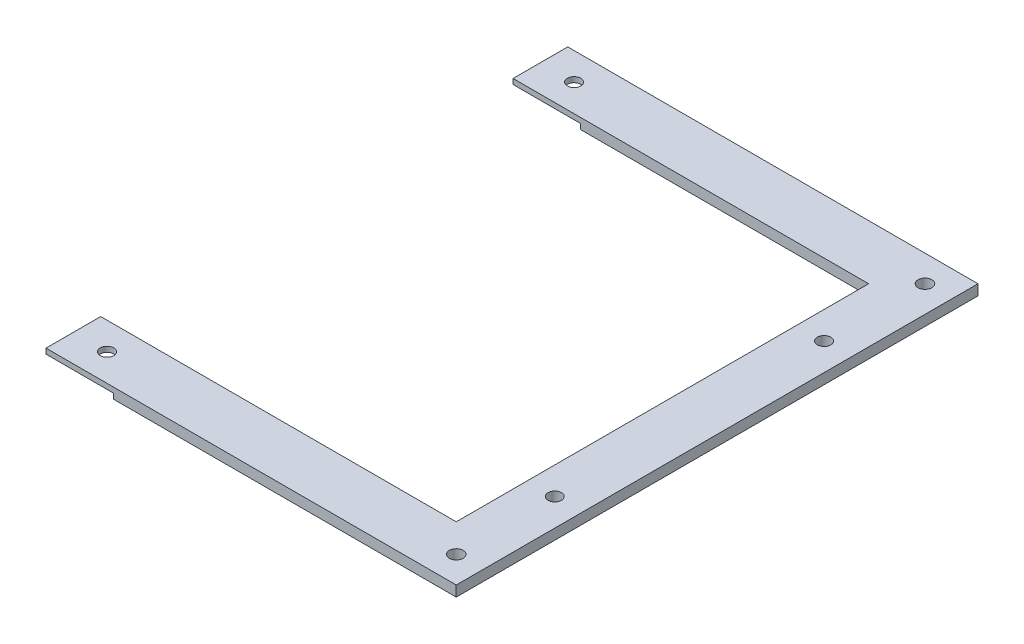
ISO-10303-21;
HEADER;
FILE_DESCRIPTION(('STEP AP214'),'2;1');
FILE_NAME('part.step','',(''),(''),'','','');
FILE_SCHEMA(('AUTOMOTIVE_DESIGN { 1 0 10303 214 1 1 1 1 }'));
ENDSEC;
DATA;
#1=APPLICATION_CONTEXT('core data for automotive mechanical design processes');
#2=APPLICATION_PROTOCOL_DEFINITION('international standard','automotive_design',2000,#1);
#3=PRODUCT_CONTEXT('',#1,'mechanical');
#4=PRODUCT('Part','Part','',(#3));
#5=PRODUCT_RELATED_PRODUCT_CATEGORY('part','',(#4));
#6=PRODUCT_DEFINITION_FORMATION('','',#4);
#7=PRODUCT_DEFINITION_CONTEXT('part definition',#1,'design');
#8=PRODUCT_DEFINITION('design','',#6,#7);
#9=PRODUCT_DEFINITION_SHAPE('','',#8);
#10=(LENGTH_UNIT() NAMED_UNIT(*) SI_UNIT(.MILLI.,.METRE.));
#11=(NAMED_UNIT(*) PLANE_ANGLE_UNIT() SI_UNIT($,.RADIAN.));
#12=(NAMED_UNIT(*) SI_UNIT($,.STERADIAN.) SOLID_ANGLE_UNIT());
#13=UNCERTAINTY_MEASURE_WITH_UNIT(LENGTH_MEASURE(1.E-05),#10,'distance_accuracy_value','');
#14=(GEOMETRIC_REPRESENTATION_CONTEXT(3) GLOBAL_UNCERTAINTY_ASSIGNED_CONTEXT((#13)) GLOBAL_UNIT_ASSIGNED_CONTEXT((#10,
#11,#12)) REPRESENTATION_CONTEXT('',''));
#15=CARTESIAN_POINT('',(0.,0.,0.));
#16=DIRECTION('',(0.,0.,1.));
#17=DIRECTION('',(1.,0.,0.));
#18=AXIS2_PLACEMENT_3D('',#15,#16,#17);
#19=CARTESIAN_POINT('',(-12.7,-1.984375,-98.435));
#20=DIRECTION('',(0.,-1.,0.));
#21=DIRECTION('',(1.,0.,0.));
#22=AXIS2_PLACEMENT_3D('',#19,#20,#21);
#23=PLANE('',#22);
#24=DIRECTION('',(0.,0.,1.));
#25=VECTOR('',#24,1.);
#26=CARTESIAN_POINT('',(-12.7,-1.984375,-98.435));
#27=LINE('',#26,#25);
#28=CARTESIAN_POINT('',(-12.7,-1.984375,77.7875));
#29=VERTEX_POINT('',#28);
#30=CARTESIAN_POINT('',(-12.7,-1.984375,98.425));
#31=VERTEX_POINT('',#30);
#32=EDGE_CURVE('E208',#29,#31,#27,.T.);
#33=ORIENTED_EDGE('',*,*,#32,.F.);
#34=DIRECTION('',(1.,0.,0.));
#35=VECTOR('',#34,1.);
#36=CARTESIAN_POINT('',(-121.44375,-1.98437500000001,77.7875));
#37=LINE('',#36,#35);
#38=CARTESIAN_POINT('',(12.7,-1.984375,77.7875));
#39=VERTEX_POINT('',#38);
#40=EDGE_CURVE('E233',#29,#39,#37,.T.);
#41=ORIENTED_EDGE('',*,*,#40,.T.);
#42=DIRECTION('',(0.,0.,1.));
#43=VECTOR('',#42,1.);
#44=CARTESIAN_POINT('',(12.7,-1.984375,-98.435));
#45=LINE('',#44,#43);
#46=CARTESIAN_POINT('',(12.7,-1.984375,98.425));
#47=VERTEX_POINT('',#46);
#48=EDGE_CURVE('E11',#39,#47,#45,.T.);
#49=ORIENTED_EDGE('',*,*,#48,.T.);
#50=DIRECTION('',(1.,0.,0.));
#51=VECTOR('',#50,1.);
#52=CARTESIAN_POINT('',(-142.08125,-1.98437500000002,98.425));
#53=LINE('',#52,#51);
#54=EDGE_CURVE('E224',#31,#47,#53,.T.);
#55=ORIENTED_EDGE('',*,*,#54,.F.);
#56=EDGE_LOOP('',(#33,#41,#49,#55));
#57=FACE_BOUND('',#56,.T.);
#58=CARTESIAN_POINT('',(0.,-1.984375,88.10625));
#59=DIRECTION('',(0.,-1.,0.));
#60=DIRECTION('',(1.,0.,0.));
#61=AXIS2_PLACEMENT_3D('',#58,#59,#60);
#62=CIRCLE('',#61,2.5273);
#63=CARTESIAN_POINT('',(2.52729999999998,-1.984375,88.10625));
#64=VERTEX_POINT('',#63);
#65=EDGE_CURVE('E143',#64,#64,#62,.F.);
#66=ORIENTED_EDGE('',*,*,#65,.T.);
#67=EDGE_LOOP('',(#66));
#68=FACE_BOUND('',#67,.T.);
#69=ADVANCED_FACE('F32',(#57,#68),#23,.T.);
#70=CARTESIAN_POINT('',(-12.7,0.,-98.435));
#71=DIRECTION('',(-1.,0.,0.));
#72=DIRECTION('',(0.,-1.,0.));
#73=AXIS2_PLACEMENT_3D('',#70,#71,#72);
#74=PLANE('',#73);
#75=DIRECTION('',(0.,0.,1.));
#76=VECTOR('',#75,1.);
#77=CARTESIAN_POINT('',(-12.7,0.,0.));
#78=LINE('',#77,#76);
#79=CARTESIAN_POINT('',(-12.7,0.,77.7875));
#80=VERTEX_POINT('',#79);
#81=CARTESIAN_POINT('',(-12.7,0.,98.425));
#82=VERTEX_POINT('',#81);
#83=EDGE_CURVE('E210',#80,#82,#78,.T.);
#84=ORIENTED_EDGE('',*,*,#83,.F.);
#85=DIRECTION('',(0.,-1.,0.));
#86=VECTOR('',#85,1.);
#87=CARTESIAN_POINT('',(-12.7,-3.96875000000057,77.7875));
#88=LINE('',#87,#86);
#89=EDGE_CURVE('E230',#80,#29,#88,.T.);
#90=ORIENTED_EDGE('',*,*,#89,.T.);
#91=ORIENTED_EDGE('',*,*,#32,.T.);
#92=DIRECTION('',(0.,-1.,0.));
#93=VECTOR('',#92,1.);
#94=CARTESIAN_POINT('',(-12.7,-3.96875000000068,98.425));
#95=LINE('',#94,#93);
#96=EDGE_CURVE('E136',#82,#31,#95,.T.);
#97=ORIENTED_EDGE('',*,*,#96,.F.);
#98=EDGE_LOOP('',(#84,#90,#91,#97));
#99=FACE_BOUND('',#98,.T.);
#100=ADVANCED_FACE('F296',(#99),#74,.T.);
#101=CARTESIAN_POINT('',(12.7,-1.984375,-98.435));
#102=DIRECTION('',(-1.,0.,0.));
#103=DIRECTION('',(0.,-1.,0.));
#104=AXIS2_PLACEMENT_3D('',#101,#102,#103);
#105=PLANE('',#104);
#106=ORIENTED_EDGE('',*,*,#48,.F.);
#107=DIRECTION('',(0.,-1.,0.));
#108=VECTOR('',#107,1.);
#109=CARTESIAN_POINT('',(12.7,-3.9687500000007,77.7875));
#110=LINE('',#109,#108);
#111=CARTESIAN_POINT('',(12.7,-3.96875,77.7875));
#112=VERTEX_POINT('',#111);
#113=EDGE_CURVE('E236',#39,#112,#110,.T.);
#114=ORIENTED_EDGE('',*,*,#113,.T.);
#115=DIRECTION('',(0.,0.,1.));
#116=VECTOR('',#115,1.);
#117=CARTESIAN_POINT('',(12.7,-3.96875,0.));
#118=LINE('',#117,#116);
#119=CARTESIAN_POINT('',(12.6999999999999,-3.96875,98.425));
#120=VERTEX_POINT('',#119);
#121=EDGE_CURVE('E137',#112,#120,#118,.T.);
#122=ORIENTED_EDGE('',*,*,#121,.T.);
#123=DIRECTION('',(0.,-1.,0.));
#124=VECTOR('',#123,1.);
#125=CARTESIAN_POINT('',(12.7,-3.96875000000081,98.425));
#126=LINE('',#125,#124);
#127=EDGE_CURVE('E221',#47,#120,#126,.T.);
#128=ORIENTED_EDGE('',*,*,#127,.F.);
#129=EDGE_LOOP('',(#106,#114,#122,#128));
#130=FACE_BOUND('',#129,.T.);
#131=ADVANCED_FACE('F297',(#130),#105,.T.);
#132=CARTESIAN_POINT('',(0.,-1.984375,-88.10625));
#133=DIRECTION('',(0.,-1.,0.));
#134=DIRECTION('',(1.,0.,0.));
#135=AXIS2_PLACEMENT_3D('',#132,#133,#134);
#136=CIRCLE('',#135,2.5273);
#137=CARTESIAN_POINT('',(2.52729999999996,-1.984375,-88.10625));
#138=VERTEX_POINT('',#137);
#139=EDGE_CURVE('E148',#138,#138,#136,.F.);
#140=ORIENTED_EDGE('',*,*,#139,.T.);
#141=EDGE_LOOP('',(#140));
#142=FACE_BOUND('',#141,.T.);
#143=DIRECTION('',(-1.,0.,0.));
#144=VECTOR('',#143,1.);
#145=CARTESIAN_POINT('',(142.08125,-1.98437499999998,-98.425));
#146=LINE('',#145,#144);
#147=CARTESIAN_POINT('',(12.7,-1.984375,-98.425));
#148=VERTEX_POINT('',#147);
#149=CARTESIAN_POINT('',(-12.7,-1.984375,-98.425));
#150=VERTEX_POINT('',#149);
#151=EDGE_CURVE('E215',#148,#150,#146,.T.);
#152=ORIENTED_EDGE('',*,*,#151,.F.);
#153=CARTESIAN_POINT('',(12.7,-1.984375,-77.7875));
#154=VERTEX_POINT('',#153);
#155=EDGE_CURVE('E42',#148,#154,#45,.T.);
#156=ORIENTED_EDGE('',*,*,#155,.T.);
#157=DIRECTION('',(-1.,0.,0.));
#158=VECTOR('',#157,1.);
#159=CARTESIAN_POINT('',(121.44375,-1.98437499999998,-77.7875));
#160=LINE('',#159,#158);
#161=CARTESIAN_POINT('',(-12.7,-1.984375,-77.7875));
#162=VERTEX_POINT('',#161);
#163=EDGE_CURVE('E142',#154,#162,#160,.T.);
#164=ORIENTED_EDGE('',*,*,#163,.T.);
#165=EDGE_CURVE('E206',#150,#162,#27,.T.);
#166=ORIENTED_EDGE('',*,*,#165,.F.);
#167=EDGE_LOOP('',(#152,#156,#164,#166));
#168=FACE_BOUND('',#167,.T.);
#169=ADVANCED_FACE('F244',(#142,#168),#23,.T.);
#170=DIRECTION('',(0.,1.,0.));
#171=VECTOR('',#170,1.);
#172=CARTESIAN_POINT('',(12.7,-3.96874999999932,-98.425));
#173=LINE('',#172,#171);
#174=CARTESIAN_POINT('',(12.7,-3.96875,-98.425));
#175=VERTEX_POINT('',#174);
#176=EDGE_CURVE('E135',#175,#148,#173,.T.);
#177=ORIENTED_EDGE('',*,*,#176,.F.);
#178=CARTESIAN_POINT('',(12.7,-3.96875,-77.7875));
#179=VERTEX_POINT('',#178);
#180=EDGE_CURVE('E122',#175,#179,#118,.T.);
#181=ORIENTED_EDGE('',*,*,#180,.T.);
#182=DIRECTION('',(0.,1.,0.));
#183=VECTOR('',#182,1.);
#184=CARTESIAN_POINT('',(12.7,-3.96874999999943,-77.7875));
#185=LINE('',#184,#183);
#186=EDGE_CURVE('E132',#179,#154,#185,.T.);
#187=ORIENTED_EDGE('',*,*,#186,.T.);
#188=ORIENTED_EDGE('',*,*,#155,.F.);
#189=EDGE_LOOP('',(#177,#181,#187,#188));
#190=FACE_BOUND('',#189,.T.);
#191=ADVANCED_FACE('F131',(#190),#105,.T.);
#192=DIRECTION('',(0.,1.,0.));
#193=VECTOR('',#192,1.);
#194=CARTESIAN_POINT('',(-12.7,-3.96874999999919,-98.425));
#195=LINE('',#194,#193);
#196=CARTESIAN_POINT('',(-12.6999999999999,0.,-98.425));
#197=VERTEX_POINT('',#196);
#198=EDGE_CURVE('E218',#150,#197,#195,.T.);
#199=ORIENTED_EDGE('',*,*,#198,.F.);
#200=ORIENTED_EDGE('',*,*,#165,.T.);
#201=DIRECTION('',(0.,1.,0.));
#202=VECTOR('',#201,1.);
#203=CARTESIAN_POINT('',(-12.7,-3.9687499999993,-77.7875));
#204=LINE('',#203,#202);
#205=CARTESIAN_POINT('',(-12.7,0.,-77.7875));
#206=VERTEX_POINT('',#205);
#207=EDGE_CURVE('E145',#162,#206,#204,.T.);
#208=ORIENTED_EDGE('',*,*,#207,.T.);
#209=EDGE_CURVE('E213',#197,#206,#78,.T.);
#210=ORIENTED_EDGE('',*,*,#209,.F.);
#211=EDGE_LOOP('',(#199,#200,#208,#210));
#212=FACE_BOUND('',#211,.T.);
#213=ADVANCED_FACE('F241',(#212),#74,.T.);
#214=CARTESIAN_POINT('',(-142.08125,-3.96875,98.425));
#215=DIRECTION('',(0.,0.,1.));
#216=DIRECTION('',(1.,0.,0.));
#217=AXIS2_PLACEMENT_3D('',#214,#215,#216);
#218=PLANE('',#217);
#219=DIRECTION('',(1.,0.,0.));
#220=VECTOR('',#219,1.);
#221=CARTESIAN_POINT('',(-142.08125,0.,98.425));
#222=LINE('',#221,#220);
#223=CARTESIAN_POINT('',(142.08125,0.,98.425));
#224=VERTEX_POINT('',#223);
#225=EDGE_CURVE('E160',#82,#224,#222,.T.);
#226=ORIENTED_EDGE('',*,*,#225,.F.);
#227=ORIENTED_EDGE('',*,*,#96,.T.);
#228=ORIENTED_EDGE('',*,*,#54,.T.);
#229=ORIENTED_EDGE('',*,*,#127,.T.);
#230=DIRECTION('',(1.,0.,0.));
#231=VECTOR('',#230,1.);
#232=CARTESIAN_POINT('',(-142.08125,-3.96875,98.425));
#233=LINE('',#232,#231);
#234=CARTESIAN_POINT('',(142.08125,-3.96875,98.425));
#235=VERTEX_POINT('',#234);
#236=EDGE_CURVE('E154',#120,#235,#233,.T.);
#237=ORIENTED_EDGE('',*,*,#236,.T.);
#238=DIRECTION('',(0.,1.,0.));
#239=VECTOR('',#238,1.);
#240=CARTESIAN_POINT('',(142.08125,-3.96875,98.425));
#241=LINE('',#240,#239);
#242=EDGE_CURVE('E212',#235,#224,#241,.T.);
#243=ORIENTED_EDGE('',*,*,#242,.T.);
#244=EDGE_LOOP('',(#226,#227,#228,#229,#237,#243));
#245=FACE_BOUND('',#244,.T.);
#246=ADVANCED_FACE('F266',(#245),#218,.T.);
#247=CARTESIAN_POINT('',(142.08125,-3.96875,-98.425));
#248=DIRECTION('',(0.,0.,-1.));
#249=DIRECTION('',(-1.,0.,0.));
#250=AXIS2_PLACEMENT_3D('',#247,#248,#249);
#251=PLANE('',#250);
#252=ORIENTED_EDGE('',*,*,#151,.T.);
#253=ORIENTED_EDGE('',*,*,#198,.T.);
#254=DIRECTION('',(-1.,0.,0.));
#255=VECTOR('',#254,1.);
#256=CARTESIAN_POINT('',(142.08125,0.,-98.425));
#257=LINE('',#256,#255);
#258=CARTESIAN_POINT('',(142.08125,0.,-98.425));
#259=VERTEX_POINT('',#258);
#260=EDGE_CURVE('E162',#259,#197,#257,.T.);
#261=ORIENTED_EDGE('',*,*,#260,.F.);
#262=DIRECTION('',(0.,1.,0.));
#263=VECTOR('',#262,1.);
#264=CARTESIAN_POINT('',(142.08125,-3.96875,-98.425));
#265=LINE('',#264,#263);
#266=CARTESIAN_POINT('',(142.08125,-3.96875,-98.425));
#267=VERTEX_POINT('',#266);
#268=EDGE_CURVE('E157',#267,#259,#265,.T.);
#269=ORIENTED_EDGE('',*,*,#268,.F.);
#270=DIRECTION('',(-1.,0.,0.));
#271=VECTOR('',#270,1.);
#272=CARTESIAN_POINT('',(142.08125,-3.96875,-98.425));
#273=LINE('',#272,#271);
#274=EDGE_CURVE('E156',#267,#175,#273,.T.);
#275=ORIENTED_EDGE('',*,*,#274,.T.);
#276=ORIENTED_EDGE('',*,*,#176,.T.);
#277=EDGE_LOOP('',(#252,#253,#261,#269,#275,#276));
#278=FACE_BOUND('',#277,.T.);
#279=ADVANCED_FACE('F246',(#278),#251,.T.);
#280=CARTESIAN_POINT('',(0.,-3.96875,0.));
#281=DIRECTION('',(0.,1.,0.));
#282=DIRECTION('',(0.,0.,1.));
#283=AXIS2_PLACEMENT_3D('',#280,#281,#282);
#284=PLANE('',#283);
#285=CARTESIAN_POINT('',(131.7625,-3.96875,-50.673));
#286=DIRECTION('',(0.,1.,0.));
#287=DIRECTION('',(0.,0.,1.));
#288=AXIS2_PLACEMENT_3D('',#285,#286,#287);
#289=CIRCLE('',#288,2.52730000000001);
#290=CARTESIAN_POINT('',(131.7625,-3.96875,-48.1457));
#291=VERTEX_POINT('',#290);
#292=EDGE_CURVE('E175',#291,#291,#289,.T.);
#293=ORIENTED_EDGE('',*,*,#292,.T.);
#294=EDGE_LOOP('',(#293));
#295=FACE_BOUND('',#294,.T.);
#296=CARTESIAN_POINT('',(131.7625,-3.96875,50.927));
#297=DIRECTION('',(0.,1.,0.));
#298=DIRECTION('',(0.,0.,1.));
#299=AXIS2_PLACEMENT_3D('',#296,#297,#298);
#300=CIRCLE('',#299,2.52730000000001);
#301=CARTESIAN_POINT('',(131.7625,-3.96875,53.4543));
#302=VERTEX_POINT('',#301);
#303=EDGE_CURVE('E188',#302,#302,#300,.T.);
#304=ORIENTED_EDGE('',*,*,#303,.T.);
#305=EDGE_LOOP('',(#304));
#306=FACE_BOUND('',#305,.T.);
#307=CARTESIAN_POINT('',(132.08125,-3.96875,88.425));
#308=DIRECTION('',(0.,1.,0.));
#309=DIRECTION('',(0.,0.,1.));
#310=AXIS2_PLACEMENT_3D('',#307,#308,#309);
#311=CIRCLE('',#310,2.60985);
#312=CARTESIAN_POINT('',(132.08125,-3.96875,91.03485));
#313=VERTEX_POINT('',#312);
#314=EDGE_CURVE('E200',#313,#313,#311,.T.);
#315=ORIENTED_EDGE('',*,*,#314,.T.);
#316=EDGE_LOOP('',(#315));
#317=FACE_BOUND('',#316,.T.);
#318=CARTESIAN_POINT('',(132.08125,-3.96875,-88.425));
#319=DIRECTION('',(0.,1.,0.));
#320=DIRECTION('',(0.,0.,1.));
#321=AXIS2_PLACEMENT_3D('',#318,#319,#320);
#322=CIRCLE('',#321,2.60985);
#323=CARTESIAN_POINT('',(132.08125,-3.96875,-85.81515));
#324=VERTEX_POINT('',#323);
#325=EDGE_CURVE('E204',#324,#324,#322,.T.);
#326=ORIENTED_EDGE('',*,*,#325,.T.);
#327=EDGE_LOOP('',(#326));
#328=FACE_BOUND('',#327,.T.);
#329=ORIENTED_EDGE('',*,*,#180,.F.);
#330=ORIENTED_EDGE('',*,*,#274,.F.);
#331=DIRECTION('',(0.,0.,-1.));
#332=VECTOR('',#331,1.);
#333=CARTESIAN_POINT('',(142.08125,-3.96875,98.425));
#334=LINE('',#333,#332);
#335=EDGE_CURVE('E159',#235,#267,#334,.T.);
#336=ORIENTED_EDGE('',*,*,#335,.F.);
#337=ORIENTED_EDGE('',*,*,#236,.F.);
#338=ORIENTED_EDGE('',*,*,#121,.F.);
#339=DIRECTION('',(1.,0.,0.));
#340=VECTOR('',#339,1.);
#341=CARTESIAN_POINT('',(-121.44375,-3.96875,77.7875));
#342=LINE('',#341,#340);
#343=CARTESIAN_POINT('',(121.44375,-3.96875,77.7875));
#344=VERTEX_POINT('',#343);
#345=EDGE_CURVE('E166',#112,#344,#342,.T.);
#346=ORIENTED_EDGE('',*,*,#345,.T.);
#347=DIRECTION('',(0.,0.,-1.));
#348=VECTOR('',#347,1.);
#349=CARTESIAN_POINT('',(121.44375,-3.96875,77.7875));
#350=LINE('',#349,#348);
#351=CARTESIAN_POINT('',(121.44375,-3.96875,-77.7875));
#352=VERTEX_POINT('',#351);
#353=EDGE_CURVE('E124',#344,#352,#350,.T.);
#354=ORIENTED_EDGE('',*,*,#353,.T.);
#355=DIRECTION('',(-1.,0.,0.));
#356=VECTOR('',#355,1.);
#357=CARTESIAN_POINT('',(121.44375,-3.96875,-77.7875));
#358=LINE('',#357,#356);
#359=EDGE_CURVE('E118',#352,#179,#358,.T.);
#360=ORIENTED_EDGE('',*,*,#359,.T.);
#361=EDGE_LOOP('',(#329,#330,#336,#337,#338,#346,#354,#360));
#362=FACE_BOUND('',#361,.T.);
#363=ADVANCED_FACE('F120',(#295,#306,#317,#328,#362),#284,.F.);
#364=CARTESIAN_POINT('',(0.,0.,0.));
#365=DIRECTION('',(0.,1.,0.));
#366=DIRECTION('',(0.,0.,1.));
#367=AXIS2_PLACEMENT_3D('',#364,#365,#366);
#368=PLANE('',#367);
#369=CARTESIAN_POINT('',(131.7625,0.,-50.673));
#370=DIRECTION('',(0.,1.,0.));
#371=DIRECTION('',(0.,0.,1.));
#372=AXIS2_PLACEMENT_3D('',#369,#370,#371);
#373=CIRCLE('',#372,2.52730000000001);
#374=CARTESIAN_POINT('',(131.7625,0.,-48.1457));
#375=VERTEX_POINT('',#374);
#376=EDGE_CURVE('E182',#375,#375,#373,.T.);
#377=ORIENTED_EDGE('',*,*,#376,.F.);
#378=EDGE_LOOP('',(#377));
#379=FACE_BOUND('',#378,.T.);
#380=CARTESIAN_POINT('',(0.,0.,88.10625));
#381=DIRECTION('',(0.,1.,0.));
#382=DIRECTION('',(0.,0.,1.));
#383=AXIS2_PLACEMENT_3D('',#380,#381,#382);
#384=CIRCLE('',#383,2.5273);
#385=CARTESIAN_POINT('',(0.,0.,90.63355));
#386=VERTEX_POINT('',#385);
#387=EDGE_CURVE('E185',#386,#386,#384,.T.);
#388=ORIENTED_EDGE('',*,*,#387,.F.);
#389=EDGE_LOOP('',(#388));
#390=FACE_BOUND('',#389,.T.);
#391=CARTESIAN_POINT('',(131.7625,0.,50.927));
#392=DIRECTION('',(0.,1.,0.));
#393=DIRECTION('',(0.,0.,1.));
#394=AXIS2_PLACEMENT_3D('',#391,#392,#393);
#395=CIRCLE('',#394,2.52730000000001);
#396=CARTESIAN_POINT('',(131.7625,0.,53.4543));
#397=VERTEX_POINT('',#396);
#398=EDGE_CURVE('E191',#397,#397,#395,.T.);
#399=ORIENTED_EDGE('',*,*,#398,.F.);
#400=EDGE_LOOP('',(#399));
#401=FACE_BOUND('',#400,.T.);
#402=CARTESIAN_POINT('',(0.,0.,-88.10625));
#403=DIRECTION('',(0.,1.,0.));
#404=DIRECTION('',(0.,0.,1.));
#405=AXIS2_PLACEMENT_3D('',#402,#403,#404);
#406=CIRCLE('',#405,2.5273);
#407=CARTESIAN_POINT('',(0.,0.,-85.57895));
#408=VERTEX_POINT('',#407);
#409=EDGE_CURVE('E194',#408,#408,#406,.T.);
#410=ORIENTED_EDGE('',*,*,#409,.F.);
#411=EDGE_LOOP('',(#410));
#412=FACE_BOUND('',#411,.T.);
#413=CARTESIAN_POINT('',(132.08125,0.,88.425));
#414=DIRECTION('',(0.,1.,0.));
#415=DIRECTION('',(0.,0.,1.));
#416=AXIS2_PLACEMENT_3D('',#413,#414,#415);
#417=CIRCLE('',#416,2.60985);
#418=CARTESIAN_POINT('',(132.08125,0.,91.03485));
#419=VERTEX_POINT('',#418);
#420=EDGE_CURVE('E197',#419,#419,#417,.T.);
#421=ORIENTED_EDGE('',*,*,#420,.F.);
#422=EDGE_LOOP('',(#421));
#423=FACE_BOUND('',#422,.T.);
#424=CARTESIAN_POINT('',(132.08125,0.,-88.425));
#425=DIRECTION('',(0.,1.,0.));
#426=DIRECTION('',(0.,0.,1.));
#427=AXIS2_PLACEMENT_3D('',#424,#425,#426);
#428=CIRCLE('',#427,2.60985);
#429=CARTESIAN_POINT('',(132.08125,0.,-85.81515));
#430=VERTEX_POINT('',#429);
#431=EDGE_CURVE('E203',#430,#430,#428,.T.);
#432=ORIENTED_EDGE('',*,*,#431,.F.);
#433=EDGE_LOOP('',(#432));
#434=FACE_BOUND('',#433,.T.);
#435=ORIENTED_EDGE('',*,*,#260,.T.);
#436=ORIENTED_EDGE('',*,*,#209,.T.);
#437=DIRECTION('',(-1.,0.,0.));
#438=VECTOR('',#437,1.);
#439=CARTESIAN_POINT('',(121.44375,0.,-77.7875));
#440=LINE('',#439,#438);
#441=CARTESIAN_POINT('',(121.44375,0.,-77.7875));
#442=VERTEX_POINT('',#441);
#443=EDGE_CURVE('E167',#442,#206,#440,.T.);
#444=ORIENTED_EDGE('',*,*,#443,.F.);
#445=DIRECTION('',(0.,0.,-1.));
#446=VECTOR('',#445,1.);
#447=CARTESIAN_POINT('',(121.44375,0.,77.7875));
#448=LINE('',#447,#446);
#449=CARTESIAN_POINT('',(121.44375,0.,77.7875));
#450=VERTEX_POINT('',#449);
#451=EDGE_CURVE('E168',#450,#442,#448,.T.);
#452=ORIENTED_EDGE('',*,*,#451,.F.);
#453=DIRECTION('',(1.,0.,0.));
#454=VECTOR('',#453,1.);
#455=CARTESIAN_POINT('',(-121.44375,0.,77.7875));
#456=LINE('',#455,#454);
#457=EDGE_CURVE('E36',#80,#450,#456,.T.);
#458=ORIENTED_EDGE('',*,*,#457,.F.);
#459=ORIENTED_EDGE('',*,*,#83,.T.);
#460=ORIENTED_EDGE('',*,*,#225,.T.);
#461=DIRECTION('',(0.,0.,-1.));
#462=VECTOR('',#461,1.);
#463=CARTESIAN_POINT('',(142.08125,0.,98.425));
#464=LINE('',#463,#462);
#465=EDGE_CURVE('E164',#224,#259,#464,.T.);
#466=ORIENTED_EDGE('',*,*,#465,.T.);
#467=EDGE_LOOP('',(#435,#436,#444,#452,#458,#459,#460,#466));
#468=FACE_BOUND('',#467,.T.);
#469=ADVANCED_FACE('F261',(#379,#390,#401,#412,#423,#434,#468),#368,.T.);
#470=CARTESIAN_POINT('',(-121.44375,-3.96875,77.7875));
#471=DIRECTION('',(0.,0.,1.));
#472=DIRECTION('',(1.,0.,0.));
#473=AXIS2_PLACEMENT_3D('',#470,#471,#472);
#474=PLANE('',#473);
#475=ORIENTED_EDGE('',*,*,#89,.F.);
#476=ORIENTED_EDGE('',*,*,#457,.T.);
#477=DIRECTION('',(0.,1.,0.));
#478=VECTOR('',#477,1.);
#479=CARTESIAN_POINT('',(121.44375,-3.96875,77.7875));
#480=LINE('',#479,#478);
#481=EDGE_CURVE('E126',#344,#450,#480,.T.);
#482=ORIENTED_EDGE('',*,*,#481,.F.);
#483=ORIENTED_EDGE('',*,*,#345,.F.);
#484=ORIENTED_EDGE('',*,*,#113,.F.);
#485=ORIENTED_EDGE('',*,*,#40,.F.);
#486=EDGE_LOOP('',(#475,#476,#482,#483,#484,#485));
#487=FACE_BOUND('',#486,.T.);
#488=ADVANCED_FACE('F34',(#487),#474,.F.);
#489=CARTESIAN_POINT('',(121.44375,-3.96875,-77.7875));
#490=DIRECTION('',(0.,0.,-1.));
#491=DIRECTION('',(-1.,0.,0.));
#492=AXIS2_PLACEMENT_3D('',#489,#490,#491);
#493=PLANE('',#492);
#494=ORIENTED_EDGE('',*,*,#207,.F.);
#495=ORIENTED_EDGE('',*,*,#163,.F.);
#496=ORIENTED_EDGE('',*,*,#186,.F.);
#497=ORIENTED_EDGE('',*,*,#359,.F.);
#498=DIRECTION('',(0.,1.,0.));
#499=VECTOR('',#498,1.);
#500=CARTESIAN_POINT('',(121.44375,-3.96875,-77.7875));
#501=LINE('',#500,#499);
#502=EDGE_CURVE('E49',#352,#442,#501,.T.);
#503=ORIENTED_EDGE('',*,*,#502,.T.);
#504=ORIENTED_EDGE('',*,*,#443,.T.);
#505=EDGE_LOOP('',(#494,#495,#496,#497,#503,#504));
#506=FACE_BOUND('',#505,.T.);
#507=ADVANCED_FACE('F140',(#506),#493,.F.);
#508=CARTESIAN_POINT('',(0.,0.,88.10625));
#509=DIRECTION('',(0.,1.,0.));
#510=DIRECTION('',(0.,0.,1.));
#511=AXIS2_PLACEMENT_3D('',#508,#509,#510);
#512=CYLINDRICAL_SURFACE('',#511,2.5273);
#513=ORIENTED_EDGE('',*,*,#387,.T.);
#514=EDGE_LOOP('',(#513));
#515=FACE_BOUND('',#514,.T.);
#516=ORIENTED_EDGE('',*,*,#65,.F.);
#517=EDGE_LOOP('',(#516));
#518=FACE_BOUND('',#517,.T.);
#519=ADVANCED_FACE('F302',(#515,#518),#512,.F.);
#520=CARTESIAN_POINT('',(0.,0.,-88.10625));
#521=DIRECTION('',(0.,1.,0.));
#522=DIRECTION('',(0.,0.,1.));
#523=AXIS2_PLACEMENT_3D('',#520,#521,#522);
#524=CYLINDRICAL_SURFACE('',#523,2.5273);
#525=ORIENTED_EDGE('',*,*,#409,.T.);
#526=EDGE_LOOP('',(#525));
#527=FACE_BOUND('',#526,.T.);
#528=ORIENTED_EDGE('',*,*,#139,.F.);
#529=EDGE_LOOP('',(#528));
#530=FACE_BOUND('',#529,.T.);
#531=ADVANCED_FACE('F300',(#527,#530),#524,.F.);
#532=CARTESIAN_POINT('',(142.08125,-3.96875,98.425));
#533=DIRECTION('',(1.,0.,0.));
#534=DIRECTION('',(0.,0.,-1.));
#535=AXIS2_PLACEMENT_3D('',#532,#533,#534);
#536=PLANE('',#535);
#537=ORIENTED_EDGE('',*,*,#465,.F.);
#538=ORIENTED_EDGE('',*,*,#242,.F.);
#539=ORIENTED_EDGE('',*,*,#335,.T.);
#540=ORIENTED_EDGE('',*,*,#268,.T.);
#541=EDGE_LOOP('',(#537,#538,#539,#540));
#542=FACE_BOUND('',#541,.T.);
#543=ADVANCED_FACE('F253',(#542),#536,.T.);
#544=CARTESIAN_POINT('',(121.44375,-3.96875,77.7875));
#545=DIRECTION('',(1.,0.,0.));
#546=DIRECTION('',(0.,0.,-1.));
#547=AXIS2_PLACEMENT_3D('',#544,#545,#546);
#548=PLANE('',#547);
#549=ORIENTED_EDGE('',*,*,#451,.T.);
#550=ORIENTED_EDGE('',*,*,#502,.F.);
#551=ORIENTED_EDGE('',*,*,#353,.F.);
#552=ORIENTED_EDGE('',*,*,#481,.T.);
#553=EDGE_LOOP('',(#549,#550,#551,#552));
#554=FACE_BOUND('',#553,.T.);
#555=ADVANCED_FACE('F399',(#554),#548,.F.);
#556=CARTESIAN_POINT('',(131.7625,0.,-50.673));
#557=DIRECTION('',(0.,1.,0.));
#558=DIRECTION('',(0.,0.,1.));
#559=AXIS2_PLACEMENT_3D('',#556,#557,#558);
#560=CYLINDRICAL_SURFACE('',#559,2.52730000000001);
#561=ORIENTED_EDGE('',*,*,#292,.F.);
#562=EDGE_LOOP('',(#561));
#563=FACE_BOUND('',#562,.T.);
#564=ORIENTED_EDGE('',*,*,#376,.T.);
#565=EDGE_LOOP('',(#564));
#566=FACE_BOUND('',#565,.T.);
#567=ADVANCED_FACE('F408',(#563,#566),#560,.F.);
#568=CARTESIAN_POINT('',(131.7625,0.,50.927));
#569=DIRECTION('',(0.,1.,0.));
#570=DIRECTION('',(0.,0.,1.));
#571=AXIS2_PLACEMENT_3D('',#568,#569,#570);
#572=CYLINDRICAL_SURFACE('',#571,2.52730000000001);
#573=ORIENTED_EDGE('',*,*,#303,.F.);
#574=EDGE_LOOP('',(#573));
#575=FACE_BOUND('',#574,.T.);
#576=ORIENTED_EDGE('',*,*,#398,.T.);
#577=EDGE_LOOP('',(#576));
#578=FACE_BOUND('',#577,.T.);
#579=ADVANCED_FACE('F417',(#575,#578),#572,.F.);
#580=CARTESIAN_POINT('',(132.08125,4.4196,88.425));
#581=DIRECTION('',(0.,1.,0.));
#582=DIRECTION('',(0.,0.,1.));
#583=AXIS2_PLACEMENT_3D('',#580,#581,#582);
#584=CYLINDRICAL_SURFACE('',#583,2.60985);
#585=ORIENTED_EDGE('',*,*,#420,.T.);
#586=EDGE_LOOP('',(#585));
#587=FACE_BOUND('',#586,.T.);
#588=ORIENTED_EDGE('',*,*,#314,.F.);
#589=EDGE_LOOP('',(#588));
#590=FACE_BOUND('',#589,.T.);
#591=ADVANCED_FACE('F427',(#587,#590),#584,.F.);
#592=CARTESIAN_POINT('',(132.08125,4.4196,-88.425));
#593=DIRECTION('',(0.,1.,0.));
#594=DIRECTION('',(0.,0.,1.));
#595=AXIS2_PLACEMENT_3D('',#592,#593,#594);
#596=CYLINDRICAL_SURFACE('',#595,2.60985);
#597=ORIENTED_EDGE('',*,*,#431,.T.);
#598=EDGE_LOOP('',(#597));
#599=FACE_BOUND('',#598,.T.);
#600=ORIENTED_EDGE('',*,*,#325,.F.);
#601=EDGE_LOOP('',(#600));
#602=FACE_BOUND('',#601,.T.);
#603=ADVANCED_FACE('F272',(#599,#602),#596,.F.);
#604=CLOSED_SHELL('',(#69,#100,#131,#169,#191,#213,#246,#279,#363,#469,#488,#507,#519,#531,#543,
#555,#567,#579,#591,#603));
#605=MANIFOLD_SOLID_BREP('B2',#604);
#606=ADVANCED_BREP_SHAPE_REPRESENTATION('',(#18,#605),#14);
#607=SHAPE_DEFINITION_REPRESENTATION(#9,#606);
ENDSEC;
END-ISO-10303-21;
